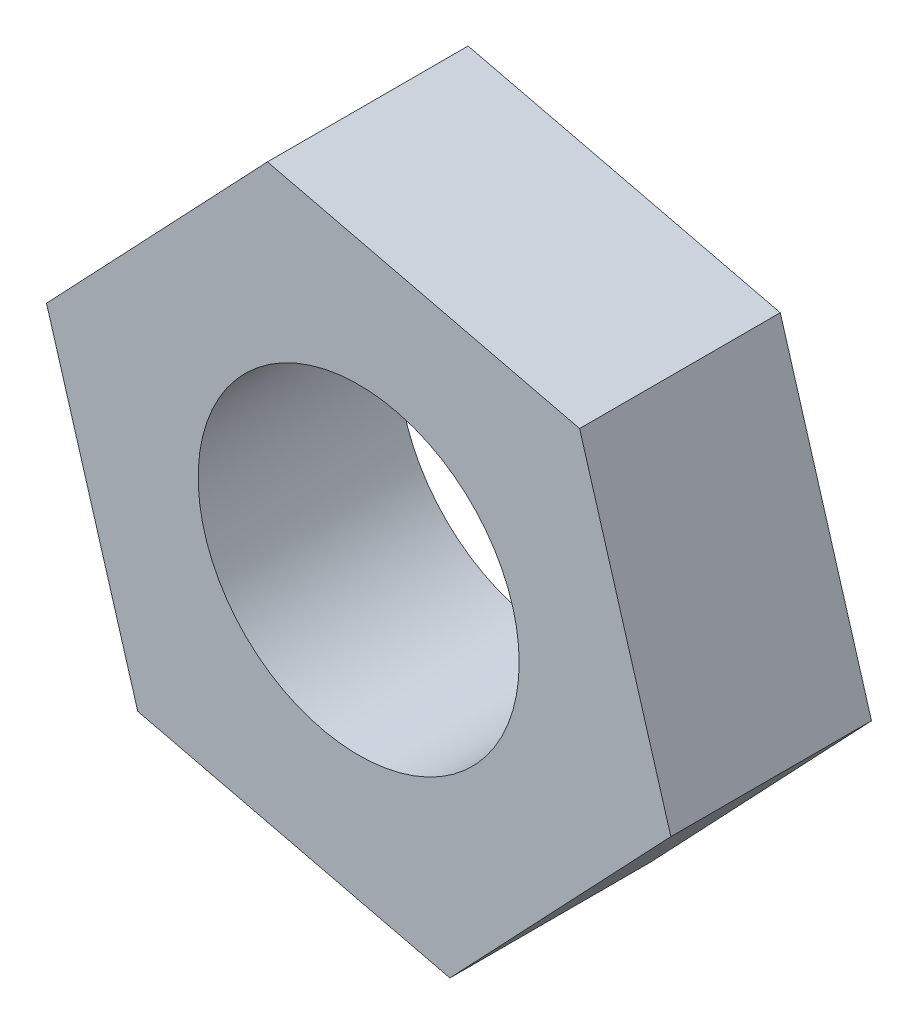
ISO-10303-21;
HEADER;
FILE_DESCRIPTION(('STEP AP214'),'2;1');
FILE_NAME('part.step','',(''),(''),'','','');
FILE_SCHEMA(('AUTOMOTIVE_DESIGN { 1 0 10303 214 1 1 1 1 }'));
ENDSEC;
DATA;
#1=APPLICATION_CONTEXT('core data for automotive mechanical design processes');
#2=APPLICATION_PROTOCOL_DEFINITION('international standard','automotive_design',2000,#1);
#3=PRODUCT_CONTEXT('',#1,'mechanical');
#4=PRODUCT('Part','Part','',(#3));
#5=PRODUCT_RELATED_PRODUCT_CATEGORY('part','',(#4));
#6=PRODUCT_DEFINITION_FORMATION('','',#4);
#7=PRODUCT_DEFINITION_CONTEXT('part definition',#1,'design');
#8=PRODUCT_DEFINITION('design','',#6,#7);
#9=PRODUCT_DEFINITION_SHAPE('','',#8);
#10=(LENGTH_UNIT() NAMED_UNIT(*) SI_UNIT(.MILLI.,.METRE.));
#11=(NAMED_UNIT(*) PLANE_ANGLE_UNIT() SI_UNIT($,.RADIAN.));
#12=(NAMED_UNIT(*) SI_UNIT($,.STERADIAN.) SOLID_ANGLE_UNIT());
#13=UNCERTAINTY_MEASURE_WITH_UNIT(LENGTH_MEASURE(1.E-05),#10,'distance_accuracy_value','');
#14=(GEOMETRIC_REPRESENTATION_CONTEXT(3) GLOBAL_UNCERTAINTY_ASSIGNED_CONTEXT((#13)) GLOBAL_UNIT_ASSIGNED_CONTEXT((#10,
#11,#12)) REPRESENTATION_CONTEXT('',''));
#15=CARTESIAN_POINT('',(0.,0.,0.));
#16=DIRECTION('',(0.,0.,1.));
#17=DIRECTION('',(1.,0.,0.));
#18=AXIS2_PLACEMENT_3D('',#15,#16,#17);
#19=CARTESIAN_POINT('',(7.77931027261709,-1.86610066243873,5.));
#20=DIRECTION('',(-0.958766331403376,-0.284195569577204,0.));
#21=DIRECTION('',(0.284195569577204,-0.958766331403376,0.));
#22=AXIS2_PLACEMENT_3D('',#19,#20,#21);
#23=PLANE('',#22);
#24=DIRECTION('',(-0.284195569577204,0.958766331403376,0.));
#25=VECTOR('',#24,1.);
#26=CARTESIAN_POINT('',(7.77931027261709,-1.86610066243873,0.));
#27=LINE('',#26,#25);
#28=CARTESIAN_POINT('',(7.77931027261709,-1.86610066243873,0.));
#29=VERTEX_POINT('',#28);
#30=CARTESIAN_POINT('',(5.50574571599945,5.80402998878828,0.));
#31=VERTEX_POINT('',#30);
#32=EDGE_CURVE('E118',#29,#31,#27,.T.);
#33=ORIENTED_EDGE('',*,*,#32,.T.);
#34=DIRECTION('',(0.,0.,-1.));
#35=VECTOR('',#34,1.);
#36=CARTESIAN_POINT('',(5.50574571599945,5.80402998878828,5.));
#37=LINE('',#36,#35);
#38=CARTESIAN_POINT('',(5.50574571599945,5.80402998878828,5.));
#39=VERTEX_POINT('',#38);
#40=EDGE_CURVE('E11',#39,#31,#37,.T.);
#41=ORIENTED_EDGE('',*,*,#40,.F.);
#42=DIRECTION('',(-0.284195569577204,0.958766331403376,0.));
#43=VECTOR('',#42,1.);
#44=CARTESIAN_POINT('',(7.77931027261709,-1.86610066243873,5.));
#45=LINE('',#44,#43);
#46=CARTESIAN_POINT('',(7.77931027261709,-1.86610066243873,5.));
#47=VERTEX_POINT('',#46);
#48=EDGE_CURVE('E129',#47,#39,#45,.T.);
#49=ORIENTED_EDGE('',*,*,#48,.F.);
#50=DIRECTION('',(0.,0.,-1.));
#51=VECTOR('',#50,1.);
#52=CARTESIAN_POINT('',(7.77931027261709,-1.86610066243873,5.));
#53=LINE('',#52,#51);
#54=EDGE_CURVE('E114',#47,#29,#53,.T.);
#55=ORIENTED_EDGE('',*,*,#54,.T.);
#56=EDGE_LOOP('',(#33,#41,#49,#55));
#57=FACE_BOUND('',#56,.T.);
#58=ADVANCED_FACE('F34',(#57),#23,.F.);
#59=CARTESIAN_POINT('',(5.50574571599945,5.80402998878828,5.));
#60=DIRECTION('',(-0.233262582804841,-0.972413784077136,0.));
#61=DIRECTION('',(0.972413784077136,-0.233262582804841,0.));
#62=AXIS2_PLACEMENT_3D('',#59,#60,#61);
#63=PLANE('',#62);
#64=DIRECTION('',(-0.972413784077136,0.233262582804841,0.));
#65=VECTOR('',#64,1.);
#66=CARTESIAN_POINT('',(5.50574571599945,5.80402998878828,0.));
#67=LINE('',#66,#65);
#68=CARTESIAN_POINT('',(-2.27356455661763,7.67013065122701,0.));
#69=VERTEX_POINT('',#68);
#70=EDGE_CURVE('E121',#31,#69,#67,.T.);
#71=ORIENTED_EDGE('',*,*,#70,.T.);
#72=DIRECTION('',(0.,0.,-1.));
#73=VECTOR('',#72,1.);
#74=CARTESIAN_POINT('',(-2.27356455661763,7.67013065122701,5.));
#75=LINE('',#74,#73);
#76=CARTESIAN_POINT('',(-2.27356455661763,7.67013065122701,5.));
#77=VERTEX_POINT('',#76);
#78=EDGE_CURVE('E42',#77,#69,#75,.T.);
#79=ORIENTED_EDGE('',*,*,#78,.F.);
#80=DIRECTION('',(-0.972413784077136,0.233262582804841,0.));
#81=VECTOR('',#80,1.);
#82=CARTESIAN_POINT('',(5.50574571599945,5.80402998878828,5.));
#83=LINE('',#82,#81);
#84=EDGE_CURVE('E87',#39,#77,#83,.T.);
#85=ORIENTED_EDGE('',*,*,#84,.F.);
#86=ORIENTED_EDGE('',*,*,#40,.T.);
#87=EDGE_LOOP('',(#71,#79,#85,#86));
#88=FACE_BOUND('',#87,.T.);
#89=ADVANCED_FACE('F154',(#88),#63,.F.);
#90=CARTESIAN_POINT('',(-2.27356455661763,7.67013065122701,5.));
#91=DIRECTION('',(0.725503748598535,-0.688218214499931,0.));
#92=DIRECTION('',(0.688218214499931,0.725503748598535,0.));
#93=AXIS2_PLACEMENT_3D('',#90,#91,#92);
#94=PLANE('',#93);
#95=DIRECTION('',(-0.688218214499931,-0.725503748598535,0.));
#96=VECTOR('',#95,1.);
#97=CARTESIAN_POINT('',(-2.27356455661763,7.67013065122701,0.));
#98=LINE('',#97,#96);
#99=CARTESIAN_POINT('',(-7.77931027261709,1.86610066243873,0.));
#100=VERTEX_POINT('',#99);
#101=EDGE_CURVE('E124',#69,#100,#98,.T.);
#102=ORIENTED_EDGE('',*,*,#101,.T.);
#103=DIRECTION('',(0.,0.,-1.));
#104=VECTOR('',#103,1.);
#105=CARTESIAN_POINT('',(-7.77931027261709,1.86610066243873,5.));
#106=LINE('',#105,#104);
#107=CARTESIAN_POINT('',(-7.77931027261709,1.86610066243873,5.));
#108=VERTEX_POINT('',#107);
#109=EDGE_CURVE('E109',#108,#100,#106,.T.);
#110=ORIENTED_EDGE('',*,*,#109,.F.);
#111=DIRECTION('',(-0.688218214499931,-0.725503748598535,0.));
#112=VECTOR('',#111,1.);
#113=CARTESIAN_POINT('',(-2.27356455661763,7.67013065122701,5.));
#114=LINE('',#113,#112);
#115=EDGE_CURVE('E100',#77,#108,#114,.T.);
#116=ORIENTED_EDGE('',*,*,#115,.F.);
#117=ORIENTED_EDGE('',*,*,#78,.T.);
#118=EDGE_LOOP('',(#102,#110,#116,#117));
#119=FACE_BOUND('',#118,.T.);
#120=ADVANCED_FACE('F135',(#119),#94,.F.);
#121=CARTESIAN_POINT('',(-7.77931027261709,1.86610066243873,5.));
#122=DIRECTION('',(0.958766331403376,0.284195569577204,0.));
#123=DIRECTION('',(-0.284195569577204,0.958766331403376,0.));
#124=AXIS2_PLACEMENT_3D('',#121,#122,#123);
#125=PLANE('',#124);
#126=DIRECTION('',(0.284195569577204,-0.958766331403376,0.));
#127=VECTOR('',#126,1.);
#128=CARTESIAN_POINT('',(-7.77931027261709,1.86610066243873,0.));
#129=LINE('',#128,#127);
#130=CARTESIAN_POINT('',(-5.50574571599945,-5.80402998878828,0.));
#131=VERTEX_POINT('',#130);
#132=EDGE_CURVE('E108',#100,#131,#129,.T.);
#133=ORIENTED_EDGE('',*,*,#132,.T.);
#134=DIRECTION('',(0.,0.,-1.));
#135=VECTOR('',#134,1.);
#136=CARTESIAN_POINT('',(-5.50574571599945,-5.80402998878828,5.));
#137=LINE('',#136,#135);
#138=CARTESIAN_POINT('',(-5.50574571599945,-5.80402998878828,5.));
#139=VERTEX_POINT('',#138);
#140=EDGE_CURVE('E105',#139,#131,#137,.T.);
#141=ORIENTED_EDGE('',*,*,#140,.F.);
#142=DIRECTION('',(0.284195569577204,-0.958766331403376,0.));
#143=VECTOR('',#142,1.);
#144=CARTESIAN_POINT('',(-7.77931027261709,1.86610066243873,5.));
#145=LINE('',#144,#143);
#146=EDGE_CURVE('E94',#108,#139,#145,.T.);
#147=ORIENTED_EDGE('',*,*,#146,.F.);
#148=ORIENTED_EDGE('',*,*,#109,.T.);
#149=EDGE_LOOP('',(#133,#141,#147,#148));
#150=FACE_BOUND('',#149,.T.);
#151=ADVANCED_FACE('F106',(#150),#125,.F.);
#152=CARTESIAN_POINT('',(-5.50574571599945,-5.80402998878828,5.));
#153=DIRECTION('',(0.233262582804841,0.972413784077136,0.));
#154=DIRECTION('',(-0.972413784077136,0.233262582804841,0.));
#155=AXIS2_PLACEMENT_3D('',#152,#153,#154);
#156=PLANE('',#155);
#157=DIRECTION('',(0.972413784077136,-0.233262582804841,0.));
#158=VECTOR('',#157,1.);
#159=CARTESIAN_POINT('',(-5.50574571599945,-5.80402998878828,0.));
#160=LINE('',#159,#158);
#161=CARTESIAN_POINT('',(2.27356455661764,-7.67013065122701,0.));
#162=VERTEX_POINT('',#161);
#163=EDGE_CURVE('E73',#131,#162,#160,.T.);
#164=ORIENTED_EDGE('',*,*,#163,.T.);
#165=DIRECTION('',(0.,0.,-1.));
#166=VECTOR('',#165,1.);
#167=CARTESIAN_POINT('',(2.27356455661764,-7.67013065122701,5.));
#168=LINE('',#167,#166);
#169=CARTESIAN_POINT('',(2.27356455661764,-7.67013065122701,5.));
#170=VERTEX_POINT('',#169);
#171=EDGE_CURVE('E110',#170,#162,#168,.T.);
#172=ORIENTED_EDGE('',*,*,#171,.F.);
#173=DIRECTION('',(0.972413784077136,-0.233262582804841,0.));
#174=VECTOR('',#173,1.);
#175=CARTESIAN_POINT('',(-5.50574571599945,-5.80402998878828,5.));
#176=LINE('',#175,#174);
#177=EDGE_CURVE('E98',#139,#170,#176,.T.);
#178=ORIENTED_EDGE('',*,*,#177,.F.);
#179=ORIENTED_EDGE('',*,*,#140,.T.);
#180=EDGE_LOOP('',(#164,#172,#178,#179));
#181=FACE_BOUND('',#180,.T.);
#182=ADVANCED_FACE('F112',(#181),#156,.F.);
#183=CARTESIAN_POINT('',(2.27356455661764,-7.67013065122701,5.));
#184=DIRECTION('',(-0.725503748598535,0.688218214499931,0.));
#185=DIRECTION('',(-0.688218214499931,-0.725503748598535,0.));
#186=AXIS2_PLACEMENT_3D('',#183,#184,#185);
#187=PLANE('',#186);
#188=DIRECTION('',(0.688218214499931,0.725503748598535,0.));
#189=VECTOR('',#188,1.);
#190=CARTESIAN_POINT('',(2.27356455661764,-7.67013065122701,0.));
#191=LINE('',#190,#189);
#192=EDGE_CURVE('E79',#162,#29,#191,.T.);
#193=ORIENTED_EDGE('',*,*,#192,.T.);
#194=ORIENTED_EDGE('',*,*,#54,.F.);
#195=DIRECTION('',(0.688218214499931,0.725503748598535,0.));
#196=VECTOR('',#195,1.);
#197=CARTESIAN_POINT('',(2.27356455661764,-7.67013065122701,5.));
#198=LINE('',#197,#196);
#199=EDGE_CURVE('E50',#170,#47,#198,.T.);
#200=ORIENTED_EDGE('',*,*,#199,.F.);
#201=ORIENTED_EDGE('',*,*,#171,.T.);
#202=EDGE_LOOP('',(#193,#194,#200,#201));
#203=FACE_BOUND('',#202,.T.);
#204=ADVANCED_FACE('F142',(#203),#187,.F.);
#205=CARTESIAN_POINT('',(5.50574571599945,5.80402998878828,5.));
#206=DIRECTION('',(0.,0.,1.));
#207=DIRECTION('',(1.,0.,0.));
#208=AXIS2_PLACEMENT_3D('',#205,#206,#207);
#209=PLANE('',#208);
#210=CARTESIAN_POINT('',(0.,0.,5.));
#211=DIRECTION('',(0.,0.,1.));
#212=DIRECTION('',(1.,0.,0.));
#213=AXIS2_PLACEMENT_3D('',#210,#211,#212);
#214=CIRCLE('',#213,4.);
#215=CARTESIAN_POINT('',(4.,0.,5.));
#216=VERTEX_POINT('',#215);
#217=EDGE_CURVE('E235',#216,#216,#214,.T.);
#218=ORIENTED_EDGE('',*,*,#217,.F.);
#219=EDGE_LOOP('',(#218));
#220=FACE_BOUND('',#219,.T.);
#221=ORIENTED_EDGE('',*,*,#48,.T.);
#222=ORIENTED_EDGE('',*,*,#84,.T.);
#223=ORIENTED_EDGE('',*,*,#115,.T.);
#224=ORIENTED_EDGE('',*,*,#146,.T.);
#225=ORIENTED_EDGE('',*,*,#177,.T.);
#226=ORIENTED_EDGE('',*,*,#199,.T.);
#227=EDGE_LOOP('',(#221,#222,#223,#224,#225,#226));
#228=FACE_BOUND('',#227,.T.);
#229=ADVANCED_FACE('F96',(#220,#228),#209,.T.);
#230=CARTESIAN_POINT('',(5.50574571599945,5.80402998878828,0.));
#231=DIRECTION('',(0.,0.,1.));
#232=DIRECTION('',(1.,0.,0.));
#233=AXIS2_PLACEMENT_3D('',#230,#231,#232);
#234=PLANE('',#233);
#235=CARTESIAN_POINT('',(0.,0.,0.));
#236=DIRECTION('',(0.,0.,1.));
#237=DIRECTION('',(1.,0.,0.));
#238=AXIS2_PLACEMENT_3D('',#235,#236,#237);
#239=CIRCLE('',#238,4.);
#240=CARTESIAN_POINT('',(4.,0.,0.));
#241=VERTEX_POINT('',#240);
#242=EDGE_CURVE('E122',#241,#241,#239,.T.);
#243=ORIENTED_EDGE('',*,*,#242,.T.);
#244=EDGE_LOOP('',(#243));
#245=FACE_BOUND('',#244,.T.);
#246=ORIENTED_EDGE('',*,*,#32,.F.);
#247=ORIENTED_EDGE('',*,*,#192,.F.);
#248=ORIENTED_EDGE('',*,*,#163,.F.);
#249=ORIENTED_EDGE('',*,*,#132,.F.);
#250=ORIENTED_EDGE('',*,*,#101,.F.);
#251=ORIENTED_EDGE('',*,*,#70,.F.);
#252=EDGE_LOOP('',(#246,#247,#248,#249,#250,#251));
#253=FACE_BOUND('',#252,.T.);
#254=ADVANCED_FACE('F138',(#245,#253),#234,.F.);
#255=CARTESIAN_POINT('',(0.,0.,0.));
#256=DIRECTION('',(0.,0.,1.));
#257=DIRECTION('',(1.,0.,0.));
#258=AXIS2_PLACEMENT_3D('',#255,#256,#257);
#259=CYLINDRICAL_SURFACE('',#258,4.);
#260=ORIENTED_EDGE('',*,*,#242,.F.);
#261=EDGE_LOOP('',(#260));
#262=FACE_BOUND('',#261,.T.);
#263=ORIENTED_EDGE('',*,*,#217,.T.);
#264=EDGE_LOOP('',(#263));
#265=FACE_BOUND('',#264,.T.);
#266=ADVANCED_FACE('F216',(#262,#265),#259,.F.);
#267=CLOSED_SHELL('',(#58,#89,#120,#151,#182,#204,#229,#254,#266));
#268=MANIFOLD_SOLID_BREP('B2',#267);
#269=ADVANCED_BREP_SHAPE_REPRESENTATION('',(#18,#268),#14);
#270=SHAPE_DEFINITION_REPRESENTATION(#9,#269);
ENDSEC;
END-ISO-10303-21;
